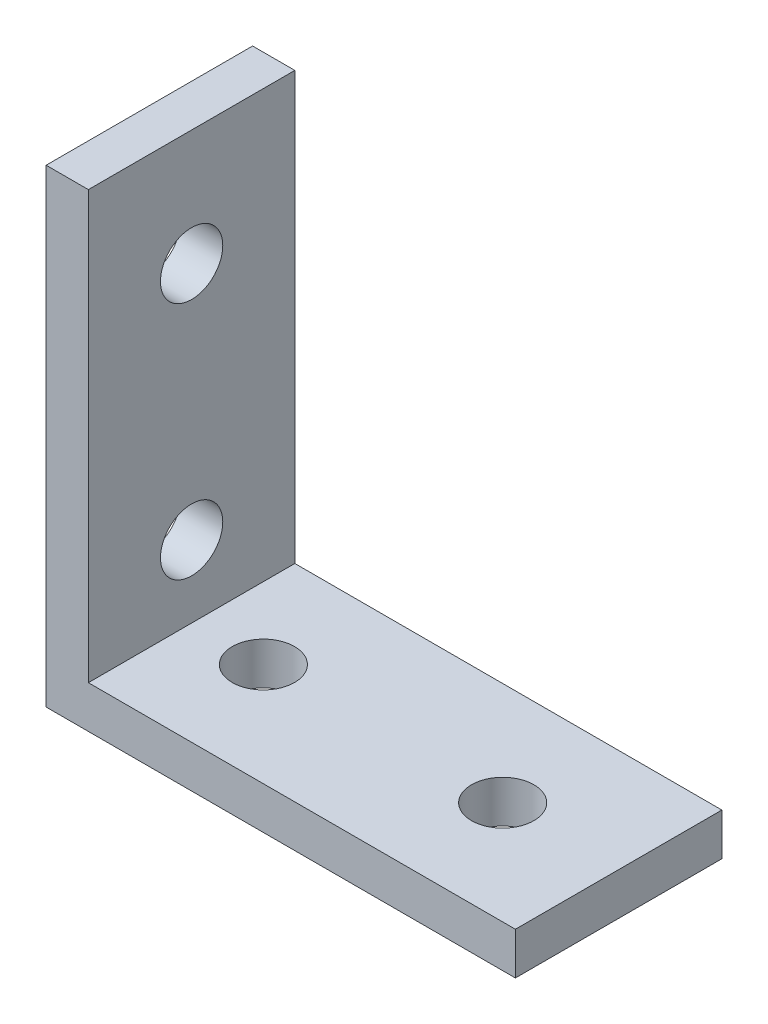
ISO-10303-21;
HEADER;
FILE_DESCRIPTION(('STEP AP214'),'2;1');
FILE_NAME('part.step','',(''),(''),'','','');
FILE_SCHEMA(('AUTOMOTIVE_DESIGN { 1 0 10303 214 1 1 1 1 }'));
ENDSEC;
DATA;
#1=APPLICATION_CONTEXT('core data for automotive mechanical design processes');
#2=APPLICATION_PROTOCOL_DEFINITION('international standard','automotive_design',2000,#1);
#3=PRODUCT_CONTEXT('',#1,'mechanical');
#4=PRODUCT('Part','Part','',(#3));
#5=PRODUCT_RELATED_PRODUCT_CATEGORY('part','',(#4));
#6=PRODUCT_DEFINITION_FORMATION('','',#4);
#7=PRODUCT_DEFINITION_CONTEXT('part definition',#1,'design');
#8=PRODUCT_DEFINITION('design','',#6,#7);
#9=PRODUCT_DEFINITION_SHAPE('','',#8);
#10=(LENGTH_UNIT() NAMED_UNIT(*) SI_UNIT(.MILLI.,.METRE.));
#11=(NAMED_UNIT(*) PLANE_ANGLE_UNIT() SI_UNIT($,.RADIAN.));
#12=(NAMED_UNIT(*) SI_UNIT($,.STERADIAN.) SOLID_ANGLE_UNIT());
#13=UNCERTAINTY_MEASURE_WITH_UNIT(LENGTH_MEASURE(1.E-05),#10,'distance_accuracy_value','');
#14=(GEOMETRIC_REPRESENTATION_CONTEXT(3) GLOBAL_UNCERTAINTY_ASSIGNED_CONTEXT((#13)) GLOBAL_UNIT_ASSIGNED_CONTEXT((#10,
#11,#12)) REPRESENTATION_CONTEXT('',''));
#15=CARTESIAN_POINT('',(0.,0.,0.));
#16=DIRECTION('',(0.,0.,1.));
#17=DIRECTION('',(1.,0.,0.));
#18=AXIS2_PLACEMENT_3D('',#15,#16,#17);
#19=CARTESIAN_POINT('',(50.8,50.8,0.));
#20=DIRECTION('',(-1.,0.,0.));
#21=DIRECTION('',(0.,0.,1.));
#22=AXIS2_PLACEMENT_3D('',#19,#20,#21);
#23=PLANE('',#22);
#24=DIRECTION('',(0.,0.,-1.));
#25=VECTOR('',#24,1.);
#26=CARTESIAN_POINT('',(50.8,4.572,94.048623594394));
#27=LINE('',#26,#25);
#28=CARTESIAN_POINT('',(50.8,4.572,0.));
#29=VERTEX_POINT('',#28);
#30=CARTESIAN_POINT('',(50.8,4.572,-22.352));
#31=VERTEX_POINT('',#30);
#32=EDGE_CURVE('E130',#29,#31,#27,.T.);
#33=ORIENTED_EDGE('',*,*,#32,.F.);
#34=DIRECTION('',(0.,-1.,0.));
#35=VECTOR('',#34,1.);
#36=CARTESIAN_POINT('',(50.8,50.8,0.));
#37=LINE('',#36,#35);
#38=CARTESIAN_POINT('',(50.8,0.,0.));
#39=VERTEX_POINT('',#38);
#40=EDGE_CURVE('E107',#29,#39,#37,.T.);
#41=ORIENTED_EDGE('',*,*,#40,.T.);
#42=DIRECTION('',(0.,0.,-1.));
#43=VECTOR('',#42,1.);
#44=CARTESIAN_POINT('',(50.8,0.,0.));
#45=LINE('',#44,#43);
#46=CARTESIAN_POINT('',(50.8,0.,-22.352));
#47=VERTEX_POINT('',#46);
#48=EDGE_CURVE('E117',#39,#47,#45,.T.);
#49=ORIENTED_EDGE('',*,*,#48,.T.);
#50=DIRECTION('',(0.,-1.,0.));
#51=VECTOR('',#50,1.);
#52=CARTESIAN_POINT('',(50.8,50.8,-22.352));
#53=LINE('',#52,#51);
#54=EDGE_CURVE('E111',#31,#47,#53,.T.);
#55=ORIENTED_EDGE('',*,*,#54,.F.);
#56=EDGE_LOOP('',(#33,#41,#49,#55));
#57=FACE_BOUND('',#56,.T.);
#58=ADVANCED_FACE('F33',(#57),#23,.F.);
#59=CARTESIAN_POINT('',(0.,50.8,0.));
#60=DIRECTION('',(0.,0.,-1.));
#61=DIRECTION('',(-1.,0.,0.));
#62=AXIS2_PLACEMENT_3D('',#59,#60,#61);
#63=PLANE('',#62);
#64=DIRECTION('',(1.,0.,0.));
#65=VECTOR('',#64,1.);
#66=CARTESIAN_POINT('',(0.,4.572,0.));
#67=LINE('',#66,#65);
#68=CARTESIAN_POINT('',(4.572,4.572,0.));
#69=VERTEX_POINT('',#68);
#70=EDGE_CURVE('E48',#69,#29,#67,.T.);
#71=ORIENTED_EDGE('',*,*,#70,.F.);
#72=DIRECTION('',(0.,-1.,0.));
#73=VECTOR('',#72,1.);
#74=CARTESIAN_POINT('',(4.572,50.8,0.));
#75=LINE('',#74,#73);
#76=CARTESIAN_POINT('',(4.572,50.8,0.));
#77=VERTEX_POINT('',#76);
#78=EDGE_CURVE('E52',#77,#69,#75,.T.);
#79=ORIENTED_EDGE('',*,*,#78,.F.);
#80=DIRECTION('',(1.,0.,0.));
#81=VECTOR('',#80,1.);
#82=CARTESIAN_POINT('',(0.,50.8,0.));
#83=LINE('',#82,#81);
#84=CARTESIAN_POINT('',(0.,50.8,0.));
#85=VERTEX_POINT('',#84);
#86=EDGE_CURVE('E93',#85,#77,#83,.T.);
#87=ORIENTED_EDGE('',*,*,#86,.F.);
#88=DIRECTION('',(0.,-1.,0.));
#89=VECTOR('',#88,1.);
#90=CARTESIAN_POINT('',(0.,50.8,0.));
#91=LINE('',#90,#89);
#92=CARTESIAN_POINT('',(0.,0.,0.));
#93=VERTEX_POINT('',#92);
#94=EDGE_CURVE('E105',#85,#93,#91,.T.);
#95=ORIENTED_EDGE('',*,*,#94,.T.);
#96=DIRECTION('',(1.,0.,0.));
#97=VECTOR('',#96,1.);
#98=CARTESIAN_POINT('',(0.,0.,0.));
#99=LINE('',#98,#97);
#100=EDGE_CURVE('E120',#93,#39,#99,.T.);
#101=ORIENTED_EDGE('',*,*,#100,.T.);
#102=ORIENTED_EDGE('',*,*,#40,.F.);
#103=EDGE_LOOP('',(#71,#79,#87,#95,#101,#102));
#104=FACE_BOUND('',#103,.T.);
#105=ADVANCED_FACE('F182',(#104),#63,.F.);
#106=CARTESIAN_POINT('',(0.,50.8,-22.352));
#107=DIRECTION('',(0.,0.,1.));
#108=DIRECTION('',(1.,0.,0.));
#109=AXIS2_PLACEMENT_3D('',#106,#107,#108);
#110=PLANE('',#109);
#111=DIRECTION('',(-1.,0.,0.));
#112=VECTOR('',#111,1.);
#113=CARTESIAN_POINT('',(0.,4.572,-22.352));
#114=LINE('',#113,#112);
#115=CARTESIAN_POINT('',(4.572,4.572,-22.352));
#116=VERTEX_POINT('',#115);
#117=EDGE_CURVE('E11',#31,#116,#114,.T.);
#118=ORIENTED_EDGE('',*,*,#117,.F.);
#119=ORIENTED_EDGE('',*,*,#54,.T.);
#120=DIRECTION('',(-1.,0.,0.));
#121=VECTOR('',#120,1.);
#122=CARTESIAN_POINT('',(0.,0.,-22.352));
#123=LINE('',#122,#121);
#124=CARTESIAN_POINT('',(0.,0.,-22.352));
#125=VERTEX_POINT('',#124);
#126=EDGE_CURVE('E114',#47,#125,#123,.T.);
#127=ORIENTED_EDGE('',*,*,#126,.T.);
#128=DIRECTION('',(0.,-1.,0.));
#129=VECTOR('',#128,1.);
#130=CARTESIAN_POINT('',(0.,50.8,-22.352));
#131=LINE('',#130,#129);
#132=CARTESIAN_POINT('',(0.,50.8,-22.352));
#133=VERTEX_POINT('',#132);
#134=EDGE_CURVE('E89',#133,#125,#131,.T.);
#135=ORIENTED_EDGE('',*,*,#134,.F.);
#136=DIRECTION('',(-1.,0.,0.));
#137=VECTOR('',#136,1.);
#138=CARTESIAN_POINT('',(0.,50.8,-22.352));
#139=LINE('',#138,#137);
#140=CARTESIAN_POINT('',(4.572,50.8,-22.352));
#141=VERTEX_POINT('',#140);
#142=EDGE_CURVE('E84',#141,#133,#139,.T.);
#143=ORIENTED_EDGE('',*,*,#142,.F.);
#144=DIRECTION('',(0.,1.,0.));
#145=VECTOR('',#144,1.);
#146=CARTESIAN_POINT('',(4.572,50.8,-22.352));
#147=LINE('',#146,#145);
#148=EDGE_CURVE('E41',#116,#141,#147,.T.);
#149=ORIENTED_EDGE('',*,*,#148,.F.);
#150=EDGE_LOOP('',(#118,#119,#127,#135,#143,#149));
#151=FACE_BOUND('',#150,.T.);
#152=ADVANCED_FACE('F86',(#151),#110,.F.);
#153=CARTESIAN_POINT('',(0.,50.8,0.));
#154=DIRECTION('',(1.,0.,0.));
#155=DIRECTION('',(0.,0.,-1.));
#156=AXIS2_PLACEMENT_3D('',#153,#154,#155);
#157=PLANE('',#156);
#158=CARTESIAN_POINT('',(0.,12.3744966910694,-11.1759990459622));
#159=DIRECTION('',(1.,0.,0.));
#160=DIRECTION('',(0.,0.,-1.));
#161=AXIS2_PLACEMENT_3D('',#158,#159,#160);
#162=CIRCLE('',#161,3.373501);
#163=CARTESIAN_POINT('',(0.,12.3744966910694,-14.5495000459622));
#164=VERTEX_POINT('',#163);
#165=EDGE_CURVE('E151',#164,#164,#162,.T.);
#166=ORIENTED_EDGE('',*,*,#165,.T.);
#167=EDGE_LOOP('',(#166));
#168=FACE_BOUND('',#167,.T.);
#169=CARTESIAN_POINT('',(0.,38.2785898197663,-11.176));
#170=DIRECTION('',(1.,0.,0.));
#171=DIRECTION('',(0.,0.,-1.));
#172=AXIS2_PLACEMENT_3D('',#169,#170,#171);
#173=CIRCLE('',#172,3.373501);
#174=CARTESIAN_POINT('',(0.,38.2785898197663,-14.549501));
#175=VERTEX_POINT('',#174);
#176=EDGE_CURVE('E145',#175,#175,#173,.T.);
#177=ORIENTED_EDGE('',*,*,#176,.T.);
#178=EDGE_LOOP('',(#177));
#179=FACE_BOUND('',#178,.T.);
#180=DIRECTION('',(0.,0.,1.));
#181=VECTOR('',#180,1.);
#182=CARTESIAN_POINT('',(0.,0.,0.));
#183=LINE('',#182,#181);
#184=EDGE_CURVE('E123',#125,#93,#183,.T.);
#185=ORIENTED_EDGE('',*,*,#184,.T.);
#186=ORIENTED_EDGE('',*,*,#94,.F.);
#187=DIRECTION('',(0.,0.,1.));
#188=VECTOR('',#187,1.);
#189=CARTESIAN_POINT('',(0.,50.8,0.));
#190=LINE('',#189,#188);
#191=EDGE_CURVE('E116',#133,#85,#190,.T.);
#192=ORIENTED_EDGE('',*,*,#191,.F.);
#193=ORIENTED_EDGE('',*,*,#134,.T.);
#194=EDGE_LOOP('',(#185,#186,#192,#193));
#195=FACE_BOUND('',#194,.T.);
#196=ADVANCED_FACE('F35',(#168,#179,#195),#157,.F.);
#197=CARTESIAN_POINT('',(0.,50.8,0.));
#198=DIRECTION('',(0.,-1.,0.));
#199=DIRECTION('',(0.,0.,-1.));
#200=AXIS2_PLACEMENT_3D('',#197,#198,#199);
#201=PLANE('',#200);
#202=ORIENTED_EDGE('',*,*,#86,.T.);
#203=DIRECTION('',(0.,0.,-1.));
#204=VECTOR('',#203,1.);
#205=CARTESIAN_POINT('',(4.572,50.8,94.048623594394));
#206=LINE('',#205,#204);
#207=EDGE_CURVE('E96',#77,#141,#206,.T.);
#208=ORIENTED_EDGE('',*,*,#207,.T.);
#209=ORIENTED_EDGE('',*,*,#142,.T.);
#210=ORIENTED_EDGE('',*,*,#191,.T.);
#211=EDGE_LOOP('',(#202,#208,#209,#210));
#212=FACE_BOUND('',#211,.T.);
#213=ADVANCED_FACE('F97',(#212),#201,.F.);
#214=CARTESIAN_POINT('',(0.,0.,0.));
#215=DIRECTION('',(0.,-1.,0.));
#216=DIRECTION('',(0.,0.,-1.));
#217=AXIS2_PLACEMENT_3D('',#214,#215,#216);
#218=PLANE('',#217);
#219=CARTESIAN_POINT('',(12.3431998371757,0.,-11.1759982617793));
#220=DIRECTION('',(0.,1.,0.));
#221=DIRECTION('',(0.,0.,1.));
#222=AXIS2_PLACEMENT_3D('',#219,#220,#221);
#223=CIRCLE('',#222,3.373501);
#224=CARTESIAN_POINT('',(12.3431998371757,0.,-7.80249726177927));
#225=VERTEX_POINT('',#224);
#226=EDGE_CURVE('E139',#225,#225,#223,.T.);
#227=ORIENTED_EDGE('',*,*,#226,.T.);
#228=EDGE_LOOP('',(#227));
#229=FACE_BOUND('',#228,.T.);
#230=CARTESIAN_POINT('',(38.249998774301,0.,-11.176));
#231=DIRECTION('',(0.,1.,0.));
#232=DIRECTION('',(0.,0.,1.));
#233=AXIS2_PLACEMENT_3D('',#230,#231,#232);
#234=CIRCLE('',#233,3.373501);
#235=CARTESIAN_POINT('',(38.249998774301,0.,-7.802499));
#236=VERTEX_POINT('',#235);
#237=EDGE_CURVE('E100',#236,#236,#234,.T.);
#238=ORIENTED_EDGE('',*,*,#237,.T.);
#239=EDGE_LOOP('',(#238));
#240=FACE_BOUND('',#239,.T.);
#241=ORIENTED_EDGE('',*,*,#184,.F.);
#242=ORIENTED_EDGE('',*,*,#126,.F.);
#243=ORIENTED_EDGE('',*,*,#48,.F.);
#244=ORIENTED_EDGE('',*,*,#100,.F.);
#245=EDGE_LOOP('',(#241,#242,#243,#244));
#246=FACE_BOUND('',#245,.T.);
#247=ADVANCED_FACE('F191',(#229,#240,#246),#218,.T.);
#248=CARTESIAN_POINT('',(4.572,4.572,94.048623594394));
#249=DIRECTION('',(0.,1.,0.));
#250=DIRECTION('',(0.,0.,1.));
#251=AXIS2_PLACEMENT_3D('',#248,#249,#250);
#252=PLANE('',#251);
#253=CARTESIAN_POINT('',(12.3431998371757,4.572,-11.1759982617793));
#254=DIRECTION('',(0.,1.,0.));
#255=DIRECTION('',(0.,0.,1.));
#256=AXIS2_PLACEMENT_3D('',#253,#254,#255);
#257=CIRCLE('',#256,3.373501);
#258=CARTESIAN_POINT('',(12.3431998371757,4.572,-7.80249726177927));
#259=VERTEX_POINT('',#258);
#260=EDGE_CURVE('E142',#259,#259,#257,.T.);
#261=ORIENTED_EDGE('',*,*,#260,.F.);
#262=EDGE_LOOP('',(#261));
#263=FACE_BOUND('',#262,.T.);
#264=CARTESIAN_POINT('',(38.249998774301,4.572,-11.176));
#265=DIRECTION('',(0.,1.,0.));
#266=DIRECTION('',(0.,0.,1.));
#267=AXIS2_PLACEMENT_3D('',#264,#265,#266);
#268=CIRCLE('',#267,3.373501);
#269=CARTESIAN_POINT('',(38.249998774301,4.572,-7.802499));
#270=VERTEX_POINT('',#269);
#271=EDGE_CURVE('E136',#270,#270,#268,.T.);
#272=ORIENTED_EDGE('',*,*,#271,.F.);
#273=EDGE_LOOP('',(#272));
#274=FACE_BOUND('',#273,.T.);
#275=DIRECTION('',(0.,0.,-1.));
#276=VECTOR('',#275,1.);
#277=CARTESIAN_POINT('',(4.572,4.572,94.048623594394));
#278=LINE('',#277,#276);
#279=EDGE_CURVE('E99',#69,#116,#278,.T.);
#280=ORIENTED_EDGE('',*,*,#279,.F.);
#281=ORIENTED_EDGE('',*,*,#70,.T.);
#282=ORIENTED_EDGE('',*,*,#32,.T.);
#283=ORIENTED_EDGE('',*,*,#117,.T.);
#284=EDGE_LOOP('',(#280,#281,#282,#283));
#285=FACE_BOUND('',#284,.T.);
#286=ADVANCED_FACE('F163',(#263,#274,#285),#252,.T.);
#287=CARTESIAN_POINT('',(4.572,50.8,94.048623594394));
#288=DIRECTION('',(1.,0.,0.));
#289=DIRECTION('',(0.,0.,-1.));
#290=AXIS2_PLACEMENT_3D('',#287,#288,#289);
#291=PLANE('',#290);
#292=CARTESIAN_POINT('',(4.572,12.3744966910694,-11.1759990459622));
#293=DIRECTION('',(1.,0.,0.));
#294=DIRECTION('',(0.,0.,-1.));
#295=AXIS2_PLACEMENT_3D('',#292,#293,#294);
#296=CIRCLE('',#295,3.373501);
#297=CARTESIAN_POINT('',(4.572,12.3744966910694,-14.5495000459622));
#298=VERTEX_POINT('',#297);
#299=EDGE_CURVE('E154',#298,#298,#296,.T.);
#300=ORIENTED_EDGE('',*,*,#299,.F.);
#301=EDGE_LOOP('',(#300));
#302=FACE_BOUND('',#301,.T.);
#303=CARTESIAN_POINT('',(4.572,38.2785898197663,-11.176));
#304=DIRECTION('',(1.,0.,0.));
#305=DIRECTION('',(0.,0.,-1.));
#306=AXIS2_PLACEMENT_3D('',#303,#304,#305);
#307=CIRCLE('',#306,3.373501);
#308=CARTESIAN_POINT('',(4.572,38.2785898197663,-14.549501));
#309=VERTEX_POINT('',#308);
#310=EDGE_CURVE('E148',#309,#309,#307,.T.);
#311=ORIENTED_EDGE('',*,*,#310,.F.);
#312=EDGE_LOOP('',(#311));
#313=FACE_BOUND('',#312,.T.);
#314=ORIENTED_EDGE('',*,*,#207,.F.);
#315=ORIENTED_EDGE('',*,*,#78,.T.);
#316=ORIENTED_EDGE('',*,*,#279,.T.);
#317=ORIENTED_EDGE('',*,*,#148,.T.);
#318=EDGE_LOOP('',(#314,#315,#316,#317));
#319=FACE_BOUND('',#318,.T.);
#320=ADVANCED_FACE('F103',(#302,#313,#319),#291,.T.);
#321=CARTESIAN_POINT('',(38.249998774301,4.572,-11.176));
#322=DIRECTION('',(0.,1.,0.));
#323=DIRECTION('',(0.,0.,1.));
#324=AXIS2_PLACEMENT_3D('',#321,#322,#323);
#325=CYLINDRICAL_SURFACE('',#324,3.373501);
#326=ORIENTED_EDGE('',*,*,#237,.F.);
#327=EDGE_LOOP('',(#326));
#328=FACE_BOUND('',#327,.T.);
#329=ORIENTED_EDGE('',*,*,#271,.T.);
#330=EDGE_LOOP('',(#329));
#331=FACE_BOUND('',#330,.T.);
#332=ADVANCED_FACE('F162',(#328,#331),#325,.F.);
#333=CARTESIAN_POINT('',(12.3431998371757,4.572,-11.1759982617793));
#334=DIRECTION('',(0.,1.,0.));
#335=DIRECTION('',(0.,0.,1.));
#336=AXIS2_PLACEMENT_3D('',#333,#334,#335);
#337=CYLINDRICAL_SURFACE('',#336,3.373501);
#338=ORIENTED_EDGE('',*,*,#226,.F.);
#339=EDGE_LOOP('',(#338));
#340=FACE_BOUND('',#339,.T.);
#341=ORIENTED_EDGE('',*,*,#260,.T.);
#342=EDGE_LOOP('',(#341));
#343=FACE_BOUND('',#342,.T.);
#344=ADVANCED_FACE('F169',(#340,#343),#337,.F.);
#345=CARTESIAN_POINT('',(4.572,38.2785898197663,-11.176));
#346=DIRECTION('',(1.,0.,0.));
#347=DIRECTION('',(0.,0.,-1.));
#348=AXIS2_PLACEMENT_3D('',#345,#346,#347);
#349=CYLINDRICAL_SURFACE('',#348,3.373501);
#350=ORIENTED_EDGE('',*,*,#176,.F.);
#351=EDGE_LOOP('',(#350));
#352=FACE_BOUND('',#351,.T.);
#353=ORIENTED_EDGE('',*,*,#310,.T.);
#354=EDGE_LOOP('',(#353));
#355=FACE_BOUND('',#354,.T.);
#356=ADVANCED_FACE('F167',(#352,#355),#349,.F.);
#357=CARTESIAN_POINT('',(4.572,12.3744966910694,-11.1759990459622));
#358=DIRECTION('',(1.,0.,0.));
#359=DIRECTION('',(0.,0.,-1.));
#360=AXIS2_PLACEMENT_3D('',#357,#358,#359);
#361=CYLINDRICAL_SURFACE('',#360,3.373501);
#362=ORIENTED_EDGE('',*,*,#165,.F.);
#363=EDGE_LOOP('',(#362));
#364=FACE_BOUND('',#363,.T.);
#365=ORIENTED_EDGE('',*,*,#299,.T.);
#366=EDGE_LOOP('',(#365));
#367=FACE_BOUND('',#366,.T.);
#368=ADVANCED_FACE('F158',(#364,#367),#361,.F.);
#369=CLOSED_SHELL('',(#58,#105,#152,#196,#213,#247,#286,#320,#332,#344,#356,#368));
#370=MANIFOLD_SOLID_BREP('B2',#369);
#371=ADVANCED_BREP_SHAPE_REPRESENTATION('',(#18,#370),#14);
#372=SHAPE_DEFINITION_REPRESENTATION(#9,#371);
ENDSEC;
END-ISO-10303-21;
